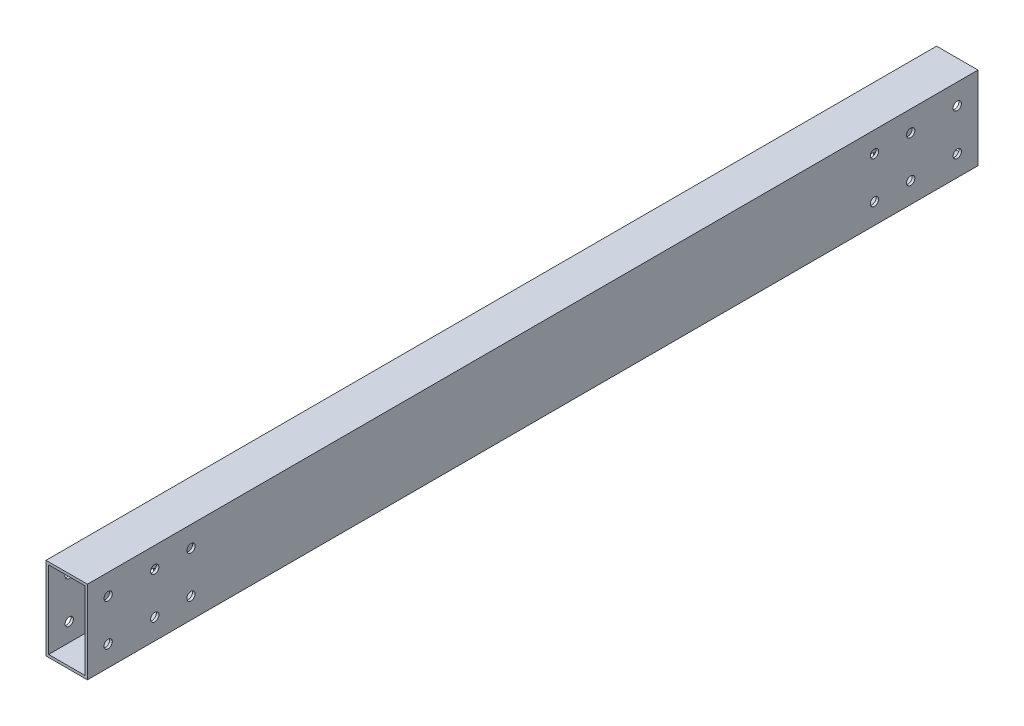
ISO-10303-21;
HEADER;
FILE_DESCRIPTION(('STEP AP214'),'2;1');
FILE_NAME('part.step','',(''),(''),'','','');
FILE_SCHEMA(('AUTOMOTIVE_DESIGN { 1 0 10303 214 1 1 1 1 }'));
ENDSEC;
DATA;
#1=APPLICATION_CONTEXT('core data for automotive mechanical design processes');
#2=APPLICATION_PROTOCOL_DEFINITION('international standard','automotive_design',2000,#1);
#3=PRODUCT_CONTEXT('',#1,'mechanical');
#4=PRODUCT('Part','Part','',(#3));
#5=PRODUCT_RELATED_PRODUCT_CATEGORY('part','',(#4));
#6=PRODUCT_DEFINITION_FORMATION('','',#4);
#7=PRODUCT_DEFINITION_CONTEXT('part definition',#1,'design');
#8=PRODUCT_DEFINITION('design','',#6,#7);
#9=PRODUCT_DEFINITION_SHAPE('','',#8);
#10=(LENGTH_UNIT() NAMED_UNIT(*) SI_UNIT(.MILLI.,.METRE.));
#11=(NAMED_UNIT(*) PLANE_ANGLE_UNIT() SI_UNIT($,.RADIAN.));
#12=(NAMED_UNIT(*) SI_UNIT($,.STERADIAN.) SOLID_ANGLE_UNIT());
#13=UNCERTAINTY_MEASURE_WITH_UNIT(LENGTH_MEASURE(1.E-05),#10,'distance_accuracy_value','');
#14=(GEOMETRIC_REPRESENTATION_CONTEXT(3) GLOBAL_UNCERTAINTY_ASSIGNED_CONTEXT((#13)) GLOBAL_UNIT_ASSIGNED_CONTEXT((#10,
#11,#12)) REPRESENTATION_CONTEXT('',''));
#15=CARTESIAN_POINT('',(0.,0.,0.));
#16=DIRECTION('',(0.,0.,1.));
#17=DIRECTION('',(1.,0.,0.));
#18=AXIS2_PLACEMENT_3D('',#15,#16,#17);
#19=CARTESIAN_POINT('',(0.,0.,546.1));
#20=DIRECTION('',(0.,0.,-1.));
#21=DIRECTION('',(-1.,0.,0.));
#22=AXIS2_PLACEMENT_3D('',#19,#20,#21);
#23=PLANE('',#22);
#24=DIRECTION('',(0.,-1.,0.));
#25=VECTOR('',#24,1.);
#26=CARTESIAN_POINT('',(0.,0.,546.1));
#27=LINE('',#26,#25);
#28=CARTESIAN_POINT('',(0.,50.8,546.1));
#29=VERTEX_POINT('',#28);
#30=CARTESIAN_POINT('',(0.,0.,546.1));
#31=VERTEX_POINT('',#30);
#32=EDGE_CURVE('E141',#29,#31,#27,.T.);
#33=ORIENTED_EDGE('',*,*,#32,.T.);
#34=DIRECTION('',(1.,0.,0.));
#35=VECTOR('',#34,1.);
#36=CARTESIAN_POINT('',(0.,0.,546.1));
#37=LINE('',#36,#35);
#38=CARTESIAN_POINT('',(25.4,0.,546.1));
#39=VERTEX_POINT('',#38);
#40=EDGE_CURVE('E144',#31,#39,#37,.T.);
#41=ORIENTED_EDGE('',*,*,#40,.T.);
#42=DIRECTION('',(0.,1.,0.));
#43=VECTOR('',#42,1.);
#44=CARTESIAN_POINT('',(25.4,0.,546.1));
#45=LINE('',#44,#43);
#46=CARTESIAN_POINT('',(25.4,50.8,546.1));
#47=VERTEX_POINT('',#46);
#48=EDGE_CURVE('E147',#39,#47,#45,.T.);
#49=ORIENTED_EDGE('',*,*,#48,.T.);
#50=DIRECTION('',(-1.,0.,0.));
#51=VECTOR('',#50,1.);
#52=CARTESIAN_POINT('',(0.,50.8,546.1));
#53=LINE('',#52,#51);
#54=EDGE_CURVE('E149',#47,#29,#53,.T.);
#55=ORIENTED_EDGE('',*,*,#54,.T.);
#56=EDGE_LOOP('',(#33,#41,#49,#55));
#57=FACE_BOUND('',#56,.T.);
#58=DIRECTION('',(0.,-1.,0.));
#59=VECTOR('',#58,1.);
#60=CARTESIAN_POINT('',(1.5875,1.5875,546.1));
#61=LINE('',#60,#59);
#62=CARTESIAN_POINT('',(1.5875,49.2125,546.1));
#63=VERTEX_POINT('',#62);
#64=CARTESIAN_POINT('',(1.5875,1.5875,546.1));
#65=VERTEX_POINT('',#64);
#66=EDGE_CURVE('E103',#63,#65,#61,.T.);
#67=ORIENTED_EDGE('',*,*,#66,.F.);
#68=DIRECTION('',(-1.,0.,0.));
#69=VECTOR('',#68,1.);
#70=CARTESIAN_POINT('',(1.5875,49.2125,546.1));
#71=LINE('',#70,#69);
#72=CARTESIAN_POINT('',(23.8125,49.2125,546.1));
#73=VERTEX_POINT('',#72);
#74=EDGE_CURVE('E125',#73,#63,#71,.T.);
#75=ORIENTED_EDGE('',*,*,#74,.F.);
#76=DIRECTION('',(0.,1.,0.));
#77=VECTOR('',#76,1.);
#78=CARTESIAN_POINT('',(23.8125,1.5875,546.1));
#79=LINE('',#78,#77);
#80=CARTESIAN_POINT('',(23.8125,1.5875,546.1));
#81=VERTEX_POINT('',#80);
#82=EDGE_CURVE('E123',#81,#73,#79,.T.);
#83=ORIENTED_EDGE('',*,*,#82,.F.);
#84=DIRECTION('',(1.,0.,0.));
#85=VECTOR('',#84,1.);
#86=CARTESIAN_POINT('',(1.5875,1.5875,546.1));
#87=LINE('',#86,#85);
#88=EDGE_CURVE('E111',#65,#81,#87,.T.);
#89=ORIENTED_EDGE('',*,*,#88,.F.);
#90=EDGE_LOOP('',(#67,#75,#83,#89));
#91=FACE_BOUND('',#90,.T.);
#92=ADVANCED_FACE('F36',(#57,#91),#23,.F.);
#93=CARTESIAN_POINT('',(0.,0.,0.));
#94=DIRECTION('',(0.,0.,-1.));
#95=DIRECTION('',(-1.,0.,0.));
#96=AXIS2_PLACEMENT_3D('',#93,#94,#95);
#97=PLANE('',#96);
#98=DIRECTION('',(0.,-1.,0.));
#99=VECTOR('',#98,1.);
#100=CARTESIAN_POINT('',(0.,0.,0.));
#101=LINE('',#100,#99);
#102=CARTESIAN_POINT('',(0.,50.8,0.));
#103=VERTEX_POINT('',#102);
#104=CARTESIAN_POINT('',(0.,0.,0.));
#105=VERTEX_POINT('',#104);
#106=EDGE_CURVE('E119',#103,#105,#101,.T.);
#107=ORIENTED_EDGE('',*,*,#106,.F.);
#108=DIRECTION('',(-1.,0.,0.));
#109=VECTOR('',#108,1.);
#110=CARTESIAN_POINT('',(0.,50.8,0.));
#111=LINE('',#110,#109);
#112=CARTESIAN_POINT('',(25.4,50.8,0.));
#113=VERTEX_POINT('',#112);
#114=EDGE_CURVE('E145',#113,#103,#111,.T.);
#115=ORIENTED_EDGE('',*,*,#114,.F.);
#116=DIRECTION('',(0.,1.,0.));
#117=VECTOR('',#116,1.);
#118=CARTESIAN_POINT('',(25.4,0.,0.));
#119=LINE('',#118,#117);
#120=CARTESIAN_POINT('',(25.4,0.,0.));
#121=VERTEX_POINT('',#120);
#122=EDGE_CURVE('E156',#121,#113,#119,.T.);
#123=ORIENTED_EDGE('',*,*,#122,.F.);
#124=DIRECTION('',(1.,0.,0.));
#125=VECTOR('',#124,1.);
#126=CARTESIAN_POINT('',(0.,0.,0.));
#127=LINE('',#126,#125);
#128=EDGE_CURVE('E154',#105,#121,#127,.T.);
#129=ORIENTED_EDGE('',*,*,#128,.F.);
#130=EDGE_LOOP('',(#107,#115,#123,#129));
#131=FACE_BOUND('',#130,.T.);
#132=DIRECTION('',(-1.,0.,0.));
#133=VECTOR('',#132,1.);
#134=CARTESIAN_POINT('',(1.5875,49.2125,0.));
#135=LINE('',#134,#133);
#136=CARTESIAN_POINT('',(23.8125,49.2125,0.));
#137=VERTEX_POINT('',#136);
#138=CARTESIAN_POINT('',(1.5875,49.2125,0.));
#139=VERTEX_POINT('',#138);
#140=EDGE_CURVE('E112',#137,#139,#135,.T.);
#141=ORIENTED_EDGE('',*,*,#140,.T.);
#142=DIRECTION('',(0.,-1.,0.));
#143=VECTOR('',#142,1.);
#144=CARTESIAN_POINT('',(1.5875,1.5875,0.));
#145=LINE('',#144,#143);
#146=CARTESIAN_POINT('',(1.5875,1.5875,0.));
#147=VERTEX_POINT('',#146);
#148=EDGE_CURVE('E61',#139,#147,#145,.T.);
#149=ORIENTED_EDGE('',*,*,#148,.T.);
#150=DIRECTION('',(1.,0.,0.));
#151=VECTOR('',#150,1.);
#152=CARTESIAN_POINT('',(1.5875,1.5875,0.));
#153=LINE('',#152,#151);
#154=CARTESIAN_POINT('',(23.8125,1.5875,0.));
#155=VERTEX_POINT('',#154);
#156=EDGE_CURVE('E118',#147,#155,#153,.T.);
#157=ORIENTED_EDGE('',*,*,#156,.T.);
#158=DIRECTION('',(0.,1.,0.));
#159=VECTOR('',#158,1.);
#160=CARTESIAN_POINT('',(23.8125,1.5875,0.));
#161=LINE('',#160,#159);
#162=EDGE_CURVE('E133',#155,#137,#161,.T.);
#163=ORIENTED_EDGE('',*,*,#162,.T.);
#164=EDGE_LOOP('',(#141,#149,#157,#163));
#165=FACE_BOUND('',#164,.T.);
#166=ADVANCED_FACE('F256',(#131,#165),#97,.T.);
#167=CARTESIAN_POINT('',(0.,0.,546.1));
#168=DIRECTION('',(1.,0.,0.));
#169=DIRECTION('',(0.,0.,-1.));
#170=AXIS2_PLACEMENT_3D('',#167,#168,#169);
#171=PLANE('',#170);
#172=CARTESIAN_POINT('',(0.,12.7,63.5));
#173=DIRECTION('',(1.,0.,0.));
#174=DIRECTION('',(0.,0.,1.));
#175=AXIS2_PLACEMENT_3D('',#172,#173,#174);
#176=CIRCLE('',#175,2.53999999999995);
#177=CARTESIAN_POINT('',(0.,12.7,66.0399999999999));
#178=VERTEX_POINT('',#177);
#179=EDGE_CURVE('E309',#178,#178,#176,.T.);
#180=ORIENTED_EDGE('',*,*,#179,.T.);
#181=EDGE_LOOP('',(#180));
#182=FACE_BOUND('',#181,.T.);
#183=CARTESIAN_POINT('',(0.,12.7,12.7));
#184=DIRECTION('',(1.,0.,0.));
#185=DIRECTION('',(0.,0.,1.));
#186=AXIS2_PLACEMENT_3D('',#183,#184,#185);
#187=CIRCLE('',#186,2.53999999999996);
#188=CARTESIAN_POINT('',(0.,12.7,15.24));
#189=VERTEX_POINT('',#188);
#190=EDGE_CURVE('E313',#189,#189,#187,.T.);
#191=ORIENTED_EDGE('',*,*,#190,.T.);
#192=EDGE_LOOP('',(#191));
#193=FACE_BOUND('',#192,.T.);
#194=CARTESIAN_POINT('',(0.,38.1,12.7));
#195=DIRECTION('',(1.,0.,0.));
#196=DIRECTION('',(0.,0.,1.));
#197=AXIS2_PLACEMENT_3D('',#194,#195,#196);
#198=CIRCLE('',#197,2.53999999999995);
#199=CARTESIAN_POINT('',(0.,38.1,15.24));
#200=VERTEX_POINT('',#199);
#201=EDGE_CURVE('E317',#200,#200,#198,.T.);
#202=ORIENTED_EDGE('',*,*,#201,.T.);
#203=EDGE_LOOP('',(#202));
#204=FACE_BOUND('',#203,.T.);
#205=CARTESIAN_POINT('',(0.,38.1,533.4));
#206=DIRECTION('',(1.,0.,0.));
#207=DIRECTION('',(0.,0.,-1.));
#208=AXIS2_PLACEMENT_3D('',#205,#206,#207);
#209=CIRCLE('',#208,2.53999999999995);
#210=CARTESIAN_POINT('',(0.,38.1,530.86));
#211=VERTEX_POINT('',#210);
#212=EDGE_CURVE('E321',#211,#211,#209,.T.);
#213=ORIENTED_EDGE('',*,*,#212,.T.);
#214=EDGE_LOOP('',(#213));
#215=FACE_BOUND('',#214,.T.);
#216=CARTESIAN_POINT('',(0.,12.7,504.825));
#217=DIRECTION('',(1.,0.,0.));
#218=DIRECTION('',(0.,0.,-1.));
#219=AXIS2_PLACEMENT_3D('',#216,#217,#218);
#220=CIRCLE('',#219,2.53999999999996);
#221=CARTESIAN_POINT('',(0.,12.7,502.285));
#222=VERTEX_POINT('',#221);
#223=EDGE_CURVE('E325',#222,#222,#220,.T.);
#224=ORIENTED_EDGE('',*,*,#223,.T.);
#225=EDGE_LOOP('',(#224));
#226=FACE_BOUND('',#225,.T.);
#227=CARTESIAN_POINT('',(0.,38.1,482.6));
#228=DIRECTION('',(1.,0.,0.));
#229=DIRECTION('',(0.,0.,-1.));
#230=AXIS2_PLACEMENT_3D('',#227,#228,#229);
#231=CIRCLE('',#230,2.53999999999995);
#232=CARTESIAN_POINT('',(0.,38.1,480.06));
#233=VERTEX_POINT('',#232);
#234=EDGE_CURVE('E329',#233,#233,#231,.T.);
#235=ORIENTED_EDGE('',*,*,#234,.T.);
#236=EDGE_LOOP('',(#235));
#237=FACE_BOUND('',#236,.T.);
#238=CARTESIAN_POINT('',(0.,12.7,482.6));
#239=DIRECTION('',(1.,0.,0.));
#240=DIRECTION('',(0.,0.,-1.));
#241=AXIS2_PLACEMENT_3D('',#238,#239,#240);
#242=CIRCLE('',#241,2.53999999999995);
#243=CARTESIAN_POINT('',(0.,12.7,480.06));
#244=VERTEX_POINT('',#243);
#245=EDGE_CURVE('E333',#244,#244,#242,.T.);
#246=ORIENTED_EDGE('',*,*,#245,.T.);
#247=EDGE_LOOP('',(#246));
#248=FACE_BOUND('',#247,.T.);
#249=CARTESIAN_POINT('',(0.,12.7,533.4));
#250=DIRECTION('',(1.,0.,0.));
#251=DIRECTION('',(0.,0.,-1.));
#252=AXIS2_PLACEMENT_3D('',#249,#250,#251);
#253=CIRCLE('',#252,2.53999999999996);
#254=CARTESIAN_POINT('',(0.,12.7,530.86));
#255=VERTEX_POINT('',#254);
#256=EDGE_CURVE('E337',#255,#255,#253,.T.);
#257=ORIENTED_EDGE('',*,*,#256,.T.);
#258=EDGE_LOOP('',(#257));
#259=FACE_BOUND('',#258,.T.);
#260=CARTESIAN_POINT('',(0.,38.1,41.2749999999999));
#261=DIRECTION('',(1.,0.,0.));
#262=DIRECTION('',(0.,0.,1.));
#263=AXIS2_PLACEMENT_3D('',#260,#261,#262);
#264=CIRCLE('',#263,2.53999999999995);
#265=CARTESIAN_POINT('',(0.,38.1,43.8149999999999));
#266=VERTEX_POINT('',#265);
#267=EDGE_CURVE('E341',#266,#266,#264,.T.);
#268=ORIENTED_EDGE('',*,*,#267,.T.);
#269=EDGE_LOOP('',(#268));
#270=FACE_BOUND('',#269,.T.);
#271=CARTESIAN_POINT('',(0.,12.7,41.2749999999999));
#272=DIRECTION('',(1.,0.,0.));
#273=DIRECTION('',(0.,0.,1.));
#274=AXIS2_PLACEMENT_3D('',#271,#272,#273);
#275=CIRCLE('',#274,2.53999999999996);
#276=CARTESIAN_POINT('',(0.,12.7,43.8149999999999));
#277=VERTEX_POINT('',#276);
#278=EDGE_CURVE('E345',#277,#277,#275,.T.);
#279=ORIENTED_EDGE('',*,*,#278,.T.);
#280=EDGE_LOOP('',(#279));
#281=FACE_BOUND('',#280,.T.);
#282=CARTESIAN_POINT('',(0.,38.1,63.5));
#283=DIRECTION('',(1.,0.,0.));
#284=DIRECTION('',(0.,0.,1.));
#285=AXIS2_PLACEMENT_3D('',#282,#283,#284);
#286=CIRCLE('',#285,2.53999999999995);
#287=CARTESIAN_POINT('',(0.,38.1,66.0399999999999));
#288=VERTEX_POINT('',#287);
#289=EDGE_CURVE('E349',#288,#288,#286,.T.);
#290=ORIENTED_EDGE('',*,*,#289,.T.);
#291=EDGE_LOOP('',(#290));
#292=FACE_BOUND('',#291,.T.);
#293=CARTESIAN_POINT('',(0.,38.1,504.825));
#294=DIRECTION('',(1.,0.,0.));
#295=DIRECTION('',(0.,0.,-1.));
#296=AXIS2_PLACEMENT_3D('',#293,#294,#295);
#297=CIRCLE('',#296,2.53999999999995);
#298=CARTESIAN_POINT('',(0.,38.1,502.285));
#299=VERTEX_POINT('',#298);
#300=EDGE_CURVE('E170',#299,#299,#297,.T.);
#301=ORIENTED_EDGE('',*,*,#300,.T.);
#302=EDGE_LOOP('',(#301));
#303=FACE_BOUND('',#302,.T.);
#304=ORIENTED_EDGE('',*,*,#106,.T.);
#305=DIRECTION('',(0.,0.,-1.));
#306=VECTOR('',#305,1.);
#307=CARTESIAN_POINT('',(0.,0.,546.1));
#308=LINE('',#307,#306);
#309=EDGE_CURVE('E11',#31,#105,#308,.T.);
#310=ORIENTED_EDGE('',*,*,#309,.F.);
#311=ORIENTED_EDGE('',*,*,#32,.F.);
#312=DIRECTION('',(0.,0.,-1.));
#313=VECTOR('',#312,1.);
#314=CARTESIAN_POINT('',(0.,50.8,546.1));
#315=LINE('',#314,#313);
#316=EDGE_CURVE('E151',#29,#103,#315,.T.);
#317=ORIENTED_EDGE('',*,*,#316,.T.);
#318=EDGE_LOOP('',(#304,#310,#311,#317));
#319=FACE_BOUND('',#318,.T.);
#320=ADVANCED_FACE('F38',(#182,#193,#204,#215,#226,#237,#248,#259,#270,#281,#292,#303,#319),
#171,.F.);
#321=CARTESIAN_POINT('',(0.,0.,546.1));
#322=DIRECTION('',(0.,1.,0.));
#323=DIRECTION('',(0.,0.,1.));
#324=AXIS2_PLACEMENT_3D('',#321,#322,#323);
#325=PLANE('',#324);
#326=ORIENTED_EDGE('',*,*,#128,.T.);
#327=DIRECTION('',(0.,0.,-1.));
#328=VECTOR('',#327,1.);
#329=CARTESIAN_POINT('',(25.4,0.,546.1));
#330=LINE('',#329,#328);
#331=EDGE_CURVE('E45',#39,#121,#330,.T.);
#332=ORIENTED_EDGE('',*,*,#331,.F.);
#333=ORIENTED_EDGE('',*,*,#40,.F.);
#334=ORIENTED_EDGE('',*,*,#309,.T.);
#335=EDGE_LOOP('',(#326,#332,#333,#334));
#336=FACE_BOUND('',#335,.T.);
#337=ADVANCED_FACE('F284',(#336),#325,.F.);
#338=CARTESIAN_POINT('',(25.4,0.,546.1));
#339=DIRECTION('',(-1.,0.,0.));
#340=DIRECTION('',(0.,0.,1.));
#341=AXIS2_PLACEMENT_3D('',#338,#339,#340);
#342=PLANE('',#341);
#343=CARTESIAN_POINT('',(25.4,12.7,63.5));
#344=DIRECTION('',(1.,0.,0.));
#345=DIRECTION('',(0.,0.,1.));
#346=AXIS2_PLACEMENT_3D('',#343,#344,#345);
#347=CIRCLE('',#346,2.53999999999995);
#348=CARTESIAN_POINT('',(25.4,12.7,66.0399999999999));
#349=VERTEX_POINT('',#348);
#350=EDGE_CURVE('E473',#349,#349,#347,.T.);
#351=ORIENTED_EDGE('',*,*,#350,.F.);
#352=EDGE_LOOP('',(#351));
#353=FACE_BOUND('',#352,.T.);
#354=CARTESIAN_POINT('',(25.4,12.7,12.7));
#355=DIRECTION('',(1.,0.,0.));
#356=DIRECTION('',(0.,0.,1.));
#357=AXIS2_PLACEMENT_3D('',#354,#355,#356);
#358=CIRCLE('',#357,2.53999999999996);
#359=CARTESIAN_POINT('',(25.4,12.7,15.24));
#360=VERTEX_POINT('',#359);
#361=EDGE_CURVE('E488',#360,#360,#358,.T.);
#362=ORIENTED_EDGE('',*,*,#361,.F.);
#363=EDGE_LOOP('',(#362));
#364=FACE_BOUND('',#363,.T.);
#365=CARTESIAN_POINT('',(25.4,38.1,12.7));
#366=DIRECTION('',(1.,0.,0.));
#367=DIRECTION('',(0.,0.,1.));
#368=AXIS2_PLACEMENT_3D('',#365,#366,#367);
#369=CIRCLE('',#368,2.53999999999995);
#370=CARTESIAN_POINT('',(25.4,38.1,15.24));
#371=VERTEX_POINT('',#370);
#372=EDGE_CURVE('E484',#371,#371,#369,.T.);
#373=ORIENTED_EDGE('',*,*,#372,.F.);
#374=EDGE_LOOP('',(#373));
#375=FACE_BOUND('',#374,.T.);
#376=CARTESIAN_POINT('',(25.4,38.1,533.4));
#377=DIRECTION('',(1.,0.,0.));
#378=DIRECTION('',(0.,0.,-1.));
#379=AXIS2_PLACEMENT_3D('',#376,#377,#378);
#380=CIRCLE('',#379,2.53999999999995);
#381=CARTESIAN_POINT('',(25.4,38.1,530.86));
#382=VERTEX_POINT('',#381);
#383=EDGE_CURVE('E480',#382,#382,#380,.T.);
#384=ORIENTED_EDGE('',*,*,#383,.F.);
#385=EDGE_LOOP('',(#384));
#386=FACE_BOUND('',#385,.T.);
#387=CARTESIAN_POINT('',(25.4,12.7,504.825));
#388=DIRECTION('',(1.,0.,0.));
#389=DIRECTION('',(0.,0.,-1.));
#390=AXIS2_PLACEMENT_3D('',#387,#388,#389);
#391=CIRCLE('',#390,2.53999999999996);
#392=CARTESIAN_POINT('',(25.4,12.7,502.285));
#393=VERTEX_POINT('',#392);
#394=EDGE_CURVE('E502',#393,#393,#391,.T.);
#395=ORIENTED_EDGE('',*,*,#394,.F.);
#396=EDGE_LOOP('',(#395));
#397=FACE_BOUND('',#396,.T.);
#398=CARTESIAN_POINT('',(25.4,38.1,482.6));
#399=DIRECTION('',(1.,0.,0.));
#400=DIRECTION('',(0.,0.,-1.));
#401=AXIS2_PLACEMENT_3D('',#398,#399,#400);
#402=CIRCLE('',#401,2.53999999999995);
#403=CARTESIAN_POINT('',(25.4,38.1,480.06));
#404=VERTEX_POINT('',#403);
#405=EDGE_CURVE('E358',#404,#404,#402,.T.);
#406=ORIENTED_EDGE('',*,*,#405,.F.);
#407=EDGE_LOOP('',(#406));
#408=FACE_BOUND('',#407,.T.);
#409=CARTESIAN_POINT('',(25.4,12.7,482.6));
#410=DIRECTION('',(1.,0.,0.));
#411=DIRECTION('',(0.,0.,-1.));
#412=AXIS2_PLACEMENT_3D('',#409,#410,#411);
#413=CIRCLE('',#412,2.53999999999995);
#414=CARTESIAN_POINT('',(25.4,12.7,480.06));
#415=VERTEX_POINT('',#414);
#416=EDGE_CURVE('E495',#415,#415,#413,.T.);
#417=ORIENTED_EDGE('',*,*,#416,.F.);
#418=EDGE_LOOP('',(#417));
#419=FACE_BOUND('',#418,.T.);
#420=CARTESIAN_POINT('',(25.4,12.7,533.4));
#421=DIRECTION('',(1.,0.,0.));
#422=DIRECTION('',(0.,0.,-1.));
#423=AXIS2_PLACEMENT_3D('',#420,#421,#422);
#424=CIRCLE('',#423,2.53999999999996);
#425=CARTESIAN_POINT('',(25.4,12.7,530.86));
#426=VERTEX_POINT('',#425);
#427=EDGE_CURVE('E479',#426,#426,#424,.T.);
#428=ORIENTED_EDGE('',*,*,#427,.F.);
#429=EDGE_LOOP('',(#428));
#430=FACE_BOUND('',#429,.T.);
#431=CARTESIAN_POINT('',(25.4,38.1,41.2749999999999));
#432=DIRECTION('',(1.,0.,0.));
#433=DIRECTION('',(0.,0.,1.));
#434=AXIS2_PLACEMENT_3D('',#431,#432,#433);
#435=CIRCLE('',#434,2.53999999999995);
#436=CARTESIAN_POINT('',(25.4,38.1,43.8149999999999));
#437=VERTEX_POINT('',#436);
#438=EDGE_CURVE('E465',#437,#437,#435,.T.);
#439=ORIENTED_EDGE('',*,*,#438,.F.);
#440=EDGE_LOOP('',(#439));
#441=FACE_BOUND('',#440,.T.);
#442=CARTESIAN_POINT('',(25.4,12.7,41.2749999999999));
#443=DIRECTION('',(1.,0.,0.));
#444=DIRECTION('',(0.,0.,1.));
#445=AXIS2_PLACEMENT_3D('',#442,#443,#444);
#446=CIRCLE('',#445,2.53999999999996);
#447=CARTESIAN_POINT('',(25.4,12.7,43.8149999999999));
#448=VERTEX_POINT('',#447);
#449=EDGE_CURVE('E464',#448,#448,#446,.T.);
#450=ORIENTED_EDGE('',*,*,#449,.F.);
#451=EDGE_LOOP('',(#450));
#452=FACE_BOUND('',#451,.T.);
#453=CARTESIAN_POINT('',(25.4,38.1,63.5));
#454=DIRECTION('',(1.,0.,0.));
#455=DIRECTION('',(0.,0.,1.));
#456=AXIS2_PLACEMENT_3D('',#453,#454,#455);
#457=CIRCLE('',#456,2.53999999999995);
#458=CARTESIAN_POINT('',(25.4,38.1,66.0399999999999));
#459=VERTEX_POINT('',#458);
#460=EDGE_CURVE('E474',#459,#459,#457,.T.);
#461=ORIENTED_EDGE('',*,*,#460,.F.);
#462=EDGE_LOOP('',(#461));
#463=FACE_BOUND('',#462,.T.);
#464=CARTESIAN_POINT('',(25.4,38.1,504.825));
#465=DIRECTION('',(1.,0.,0.));
#466=DIRECTION('',(0.,0.,-1.));
#467=AXIS2_PLACEMENT_3D('',#464,#465,#466);
#468=CIRCLE('',#467,2.53999999999995);
#469=CARTESIAN_POINT('',(25.4,38.1,502.285));
#470=VERTEX_POINT('',#469);
#471=EDGE_CURVE('E353',#470,#470,#468,.T.);
#472=ORIENTED_EDGE('',*,*,#471,.F.);
#473=EDGE_LOOP('',(#472));
#474=FACE_BOUND('',#473,.T.);
#475=ORIENTED_EDGE('',*,*,#122,.T.);
#476=DIRECTION('',(0.,0.,-1.));
#477=VECTOR('',#476,1.);
#478=CARTESIAN_POINT('',(25.4,50.8,546.1));
#479=LINE('',#478,#477);
#480=EDGE_CURVE('E161',#47,#113,#479,.T.);
#481=ORIENTED_EDGE('',*,*,#480,.F.);
#482=ORIENTED_EDGE('',*,*,#48,.F.);
#483=ORIENTED_EDGE('',*,*,#331,.T.);
#484=EDGE_LOOP('',(#475,#481,#482,#483));
#485=FACE_BOUND('',#484,.T.);
#486=ADVANCED_FACE('F281',(#353,#364,#375,#386,#397,#408,#419,#430,#441,#452,#463,#474,#485),
#342,.F.);
#487=CARTESIAN_POINT('',(0.,50.8,546.1));
#488=DIRECTION('',(0.,-1.,0.));
#489=DIRECTION('',(0.,0.,-1.));
#490=AXIS2_PLACEMENT_3D('',#487,#488,#489);
#491=PLANE('',#490);
#492=ORIENTED_EDGE('',*,*,#114,.T.);
#493=ORIENTED_EDGE('',*,*,#316,.F.);
#494=ORIENTED_EDGE('',*,*,#54,.F.);
#495=ORIENTED_EDGE('',*,*,#480,.T.);
#496=EDGE_LOOP('',(#492,#493,#494,#495));
#497=FACE_BOUND('',#496,.T.);
#498=ADVANCED_FACE('F278',(#497),#491,.F.);
#499=CARTESIAN_POINT('',(1.5875,1.5875,546.1));
#500=DIRECTION('',(1.,0.,0.));
#501=DIRECTION('',(0.,0.,-1.));
#502=AXIS2_PLACEMENT_3D('',#499,#500,#501);
#503=PLANE('',#502);
#504=CARTESIAN_POINT('',(1.5875,12.7,63.5));
#505=DIRECTION('',(1.,0.,0.));
#506=DIRECTION('',(0.,0.,-1.));
#507=AXIS2_PLACEMENT_3D('',#504,#505,#506);
#508=CIRCLE('',#507,2.53999999999995);
#509=CARTESIAN_POINT('',(1.5875,12.7,60.9600000000001));
#510=VERTEX_POINT('',#509);
#511=EDGE_CURVE('E131',#510,#510,#508,.T.);
#512=ORIENTED_EDGE('',*,*,#511,.F.);
#513=EDGE_LOOP('',(#512));
#514=FACE_BOUND('',#513,.T.);
#515=CARTESIAN_POINT('',(1.5875,12.7,12.7));
#516=DIRECTION('',(1.,0.,0.));
#517=DIRECTION('',(0.,0.,-1.));
#518=AXIS2_PLACEMENT_3D('',#515,#516,#517);
#519=CIRCLE('',#518,2.53999999999996);
#520=CARTESIAN_POINT('',(1.5875,12.7,10.1600000000001));
#521=VERTEX_POINT('',#520);
#522=EDGE_CURVE('E208',#521,#521,#519,.T.);
#523=ORIENTED_EDGE('',*,*,#522,.F.);
#524=EDGE_LOOP('',(#523));
#525=FACE_BOUND('',#524,.T.);
#526=CARTESIAN_POINT('',(1.5875,38.1,12.7));
#527=DIRECTION('',(1.,0.,0.));
#528=DIRECTION('',(0.,0.,-1.));
#529=AXIS2_PLACEMENT_3D('',#526,#527,#528);
#530=CIRCLE('',#529,2.53999999999995);
#531=CARTESIAN_POINT('',(1.5875,38.1,10.1600000000001));
#532=VERTEX_POINT('',#531);
#533=EDGE_CURVE('E205',#532,#532,#530,.T.);
#534=ORIENTED_EDGE('',*,*,#533,.F.);
#535=EDGE_LOOP('',(#534));
#536=FACE_BOUND('',#535,.T.);
#537=CARTESIAN_POINT('',(1.5875,38.1,533.4));
#538=DIRECTION('',(1.,0.,0.));
#539=DIRECTION('',(0.,0.,-1.));
#540=AXIS2_PLACEMENT_3D('',#537,#538,#539);
#541=CIRCLE('',#540,2.53999999999995);
#542=CARTESIAN_POINT('',(1.5875,38.1,530.86));
#543=VERTEX_POINT('',#542);
#544=EDGE_CURVE('E202',#543,#543,#541,.T.);
#545=ORIENTED_EDGE('',*,*,#544,.F.);
#546=EDGE_LOOP('',(#545));
#547=FACE_BOUND('',#546,.T.);
#548=CARTESIAN_POINT('',(1.5875,12.7,504.825));
#549=DIRECTION('',(1.,0.,0.));
#550=DIRECTION('',(0.,0.,-1.));
#551=AXIS2_PLACEMENT_3D('',#548,#549,#550);
#552=CIRCLE('',#551,2.53999999999996);
#553=CARTESIAN_POINT('',(1.5875,12.7,502.285));
#554=VERTEX_POINT('',#553);
#555=EDGE_CURVE('E198',#554,#554,#552,.T.);
#556=ORIENTED_EDGE('',*,*,#555,.F.);
#557=EDGE_LOOP('',(#556));
#558=FACE_BOUND('',#557,.T.);
#559=CARTESIAN_POINT('',(1.5875,38.1,482.6));
#560=DIRECTION('',(1.,0.,0.));
#561=DIRECTION('',(0.,0.,-1.));
#562=AXIS2_PLACEMENT_3D('',#559,#560,#561);
#563=CIRCLE('',#562,2.53999999999995);
#564=CARTESIAN_POINT('',(1.5875,38.1,480.06));
#565=VERTEX_POINT('',#564);
#566=EDGE_CURVE('E194',#565,#565,#563,.T.);
#567=ORIENTED_EDGE('',*,*,#566,.F.);
#568=EDGE_LOOP('',(#567));
#569=FACE_BOUND('',#568,.T.);
#570=CARTESIAN_POINT('',(1.5875,12.7,482.6));
#571=DIRECTION('',(1.,0.,0.));
#572=DIRECTION('',(0.,0.,-1.));
#573=AXIS2_PLACEMENT_3D('',#570,#571,#572);
#574=CIRCLE('',#573,2.53999999999995);
#575=CARTESIAN_POINT('',(1.5875,12.7,480.06));
#576=VERTEX_POINT('',#575);
#577=EDGE_CURVE('E190',#576,#576,#574,.T.);
#578=ORIENTED_EDGE('',*,*,#577,.F.);
#579=EDGE_LOOP('',(#578));
#580=FACE_BOUND('',#579,.T.);
#581=CARTESIAN_POINT('',(1.5875,12.7,533.4));
#582=DIRECTION('',(1.,0.,0.));
#583=DIRECTION('',(0.,0.,-1.));
#584=AXIS2_PLACEMENT_3D('',#581,#582,#583);
#585=CIRCLE('',#584,2.53999999999996);
#586=CARTESIAN_POINT('',(1.5875,12.7,530.86));
#587=VERTEX_POINT('',#586);
#588=EDGE_CURVE('E186',#587,#587,#585,.T.);
#589=ORIENTED_EDGE('',*,*,#588,.F.);
#590=EDGE_LOOP('',(#589));
#591=FACE_BOUND('',#590,.T.);
#592=CARTESIAN_POINT('',(1.5875,38.1,41.2749999999999));
#593=DIRECTION('',(1.,0.,0.));
#594=DIRECTION('',(0.,0.,-1.));
#595=AXIS2_PLACEMENT_3D('',#592,#593,#594);
#596=CIRCLE('',#595,2.53999999999995);
#597=CARTESIAN_POINT('',(1.5875,38.1,38.735));
#598=VERTEX_POINT('',#597);
#599=EDGE_CURVE('E182',#598,#598,#596,.T.);
#600=ORIENTED_EDGE('',*,*,#599,.F.);
#601=EDGE_LOOP('',(#600));
#602=FACE_BOUND('',#601,.T.);
#603=CARTESIAN_POINT('',(1.5875,12.7,41.2749999999999));
#604=DIRECTION('',(1.,0.,0.));
#605=DIRECTION('',(0.,0.,-1.));
#606=AXIS2_PLACEMENT_3D('',#603,#604,#605);
#607=CIRCLE('',#606,2.53999999999996);
#608=CARTESIAN_POINT('',(1.5875,12.7,38.735));
#609=VERTEX_POINT('',#608);
#610=EDGE_CURVE('E178',#609,#609,#607,.T.);
#611=ORIENTED_EDGE('',*,*,#610,.F.);
#612=EDGE_LOOP('',(#611));
#613=FACE_BOUND('',#612,.T.);
#614=CARTESIAN_POINT('',(1.5875,38.1,63.5));
#615=DIRECTION('',(1.,0.,0.));
#616=DIRECTION('',(0.,0.,-1.));
#617=AXIS2_PLACEMENT_3D('',#614,#615,#616);
#618=CIRCLE('',#617,2.53999999999995);
#619=CARTESIAN_POINT('',(1.5875,38.1,60.9600000000001));
#620=VERTEX_POINT('',#619);
#621=EDGE_CURVE('E174',#620,#620,#618,.T.);
#622=ORIENTED_EDGE('',*,*,#621,.F.);
#623=EDGE_LOOP('',(#622));
#624=FACE_BOUND('',#623,.T.);
#625=CARTESIAN_POINT('',(1.5875,38.1,504.825));
#626=DIRECTION('',(1.,0.,0.));
#627=DIRECTION('',(0.,0.,-1.));
#628=AXIS2_PLACEMENT_3D('',#625,#626,#627);
#629=CIRCLE('',#628,2.53999999999995);
#630=CARTESIAN_POINT('',(1.5875,38.1,502.285));
#631=VERTEX_POINT('',#630);
#632=EDGE_CURVE('E169',#631,#631,#629,.T.);
#633=ORIENTED_EDGE('',*,*,#632,.F.);
#634=EDGE_LOOP('',(#633));
#635=FACE_BOUND('',#634,.T.);
#636=ORIENTED_EDGE('',*,*,#148,.F.);
#637=DIRECTION('',(0.,0.,-1.));
#638=VECTOR('',#637,1.);
#639=CARTESIAN_POINT('',(1.5875,49.2125,546.1));
#640=LINE('',#639,#638);
#641=EDGE_CURVE('E107',#63,#139,#640,.T.);
#642=ORIENTED_EDGE('',*,*,#641,.F.);
#643=ORIENTED_EDGE('',*,*,#66,.T.);
#644=DIRECTION('',(0.,0.,-1.));
#645=VECTOR('',#644,1.);
#646=CARTESIAN_POINT('',(1.5875,1.5875,546.1));
#647=LINE('',#646,#645);
#648=EDGE_CURVE('E106',#65,#147,#647,.T.);
#649=ORIENTED_EDGE('',*,*,#648,.T.);
#650=EDGE_LOOP('',(#636,#642,#643,#649));
#651=FACE_BOUND('',#650,.T.);
#652=ADVANCED_FACE('F105',(#514,#525,#536,#547,#558,#569,#580,#591,#602,#613,#624,#635,#651),
#503,.T.);
#653=CARTESIAN_POINT('',(1.5875,1.5875,546.1));
#654=DIRECTION('',(0.,1.,0.));
#655=DIRECTION('',(0.,0.,1.));
#656=AXIS2_PLACEMENT_3D('',#653,#654,#655);
#657=PLANE('',#656);
#658=ORIENTED_EDGE('',*,*,#156,.F.);
#659=ORIENTED_EDGE('',*,*,#648,.F.);
#660=ORIENTED_EDGE('',*,*,#88,.T.);
#661=DIRECTION('',(0.,0.,-1.));
#662=VECTOR('',#661,1.);
#663=CARTESIAN_POINT('',(23.8125,1.5875,546.1));
#664=LINE('',#663,#662);
#665=EDGE_CURVE('E120',#81,#155,#664,.T.);
#666=ORIENTED_EDGE('',*,*,#665,.T.);
#667=EDGE_LOOP('',(#658,#659,#660,#666));
#668=FACE_BOUND('',#667,.T.);
#669=ADVANCED_FACE('F115',(#668),#657,.T.);
#670=CARTESIAN_POINT('',(23.8125,1.5875,546.1));
#671=DIRECTION('',(-1.,0.,0.));
#672=DIRECTION('',(0.,0.,1.));
#673=AXIS2_PLACEMENT_3D('',#670,#671,#672);
#674=PLANE('',#673);
#675=CARTESIAN_POINT('',(23.8125,12.7,63.5));
#676=DIRECTION('',(-1.,0.,0.));
#677=DIRECTION('',(0.,0.,1.));
#678=AXIS2_PLACEMENT_3D('',#675,#676,#677);
#679=CIRCLE('',#678,2.53999999999995);
#680=CARTESIAN_POINT('',(23.8125,12.7,66.0399999999999));
#681=VERTEX_POINT('',#680);
#682=EDGE_CURVE('E40',#681,#681,#679,.T.);
#683=ORIENTED_EDGE('',*,*,#682,.F.);
#684=EDGE_LOOP('',(#683));
#685=FACE_BOUND('',#684,.T.);
#686=CARTESIAN_POINT('',(23.8125,12.7,12.7));
#687=DIRECTION('',(-1.,0.,0.));
#688=DIRECTION('',(0.,0.,1.));
#689=AXIS2_PLACEMENT_3D('',#686,#687,#688);
#690=CIRCLE('',#689,2.53999999999996);
#691=CARTESIAN_POINT('',(23.8125,12.7,15.24));
#692=VERTEX_POINT('',#691);
#693=EDGE_CURVE('E206',#692,#692,#690,.T.);
#694=ORIENTED_EDGE('',*,*,#693,.F.);
#695=EDGE_LOOP('',(#694));
#696=FACE_BOUND('',#695,.T.);
#697=CARTESIAN_POINT('',(23.8125,38.1,12.7));
#698=DIRECTION('',(-1.,0.,0.));
#699=DIRECTION('',(0.,0.,1.));
#700=AXIS2_PLACEMENT_3D('',#697,#698,#699);
#701=CIRCLE('',#700,2.53999999999995);
#702=CARTESIAN_POINT('',(23.8125,38.1,15.24));
#703=VERTEX_POINT('',#702);
#704=EDGE_CURVE('E203',#703,#703,#701,.T.);
#705=ORIENTED_EDGE('',*,*,#704,.F.);
#706=EDGE_LOOP('',(#705));
#707=FACE_BOUND('',#706,.T.);
#708=CARTESIAN_POINT('',(23.8125,38.1,533.4));
#709=DIRECTION('',(-1.,0.,0.));
#710=DIRECTION('',(0.,0.,1.));
#711=AXIS2_PLACEMENT_3D('',#708,#709,#710);
#712=CIRCLE('',#711,2.53999999999995);
#713=CARTESIAN_POINT('',(23.8125,38.1,535.94));
#714=VERTEX_POINT('',#713);
#715=EDGE_CURVE('E199',#714,#714,#712,.T.);
#716=ORIENTED_EDGE('',*,*,#715,.F.);
#717=EDGE_LOOP('',(#716));
#718=FACE_BOUND('',#717,.T.);
#719=CARTESIAN_POINT('',(23.8125,12.7,504.825));
#720=DIRECTION('',(-1.,0.,0.));
#721=DIRECTION('',(0.,0.,1.));
#722=AXIS2_PLACEMENT_3D('',#719,#720,#721);
#723=CIRCLE('',#722,2.53999999999996);
#724=CARTESIAN_POINT('',(23.8125,12.7,507.365));
#725=VERTEX_POINT('',#724);
#726=EDGE_CURVE('E195',#725,#725,#723,.T.);
#727=ORIENTED_EDGE('',*,*,#726,.F.);
#728=EDGE_LOOP('',(#727));
#729=FACE_BOUND('',#728,.T.);
#730=CARTESIAN_POINT('',(23.8125,38.1,482.6));
#731=DIRECTION('',(-1.,0.,0.));
#732=DIRECTION('',(0.,0.,1.));
#733=AXIS2_PLACEMENT_3D('',#730,#731,#732);
#734=CIRCLE('',#733,2.53999999999995);
#735=CARTESIAN_POINT('',(23.8125,38.1,485.14));
#736=VERTEX_POINT('',#735);
#737=EDGE_CURVE('E191',#736,#736,#734,.T.);
#738=ORIENTED_EDGE('',*,*,#737,.F.);
#739=EDGE_LOOP('',(#738));
#740=FACE_BOUND('',#739,.T.);
#741=CARTESIAN_POINT('',(23.8125,12.7,482.6));
#742=DIRECTION('',(-1.,0.,0.));
#743=DIRECTION('',(0.,0.,1.));
#744=AXIS2_PLACEMENT_3D('',#741,#742,#743);
#745=CIRCLE('',#744,2.53999999999995);
#746=CARTESIAN_POINT('',(23.8125,12.7,485.14));
#747=VERTEX_POINT('',#746);
#748=EDGE_CURVE('E187',#747,#747,#745,.T.);
#749=ORIENTED_EDGE('',*,*,#748,.F.);
#750=EDGE_LOOP('',(#749));
#751=FACE_BOUND('',#750,.T.);
#752=CARTESIAN_POINT('',(23.8125,12.7,533.4));
#753=DIRECTION('',(-1.,0.,0.));
#754=DIRECTION('',(0.,0.,1.));
#755=AXIS2_PLACEMENT_3D('',#752,#753,#754);
#756=CIRCLE('',#755,2.53999999999996);
#757=CARTESIAN_POINT('',(23.8125,12.7,535.94));
#758=VERTEX_POINT('',#757);
#759=EDGE_CURVE('E183',#758,#758,#756,.T.);
#760=ORIENTED_EDGE('',*,*,#759,.F.);
#761=EDGE_LOOP('',(#760));
#762=FACE_BOUND('',#761,.T.);
#763=CARTESIAN_POINT('',(23.8125,38.1,41.2749999999999));
#764=DIRECTION('',(-1.,0.,0.));
#765=DIRECTION('',(0.,0.,1.));
#766=AXIS2_PLACEMENT_3D('',#763,#764,#765);
#767=CIRCLE('',#766,2.53999999999995);
#768=CARTESIAN_POINT('',(23.8125,38.1,43.8149999999999));
#769=VERTEX_POINT('',#768);
#770=EDGE_CURVE('E179',#769,#769,#767,.T.);
#771=ORIENTED_EDGE('',*,*,#770,.F.);
#772=EDGE_LOOP('',(#771));
#773=FACE_BOUND('',#772,.T.);
#774=CARTESIAN_POINT('',(23.8125,12.7,41.2749999999999));
#775=DIRECTION('',(-1.,0.,0.));
#776=DIRECTION('',(0.,0.,1.));
#777=AXIS2_PLACEMENT_3D('',#774,#775,#776);
#778=CIRCLE('',#777,2.53999999999996);
#779=CARTESIAN_POINT('',(23.8125,12.7,43.8149999999999));
#780=VERTEX_POINT('',#779);
#781=EDGE_CURVE('E175',#780,#780,#778,.T.);
#782=ORIENTED_EDGE('',*,*,#781,.F.);
#783=EDGE_LOOP('',(#782));
#784=FACE_BOUND('',#783,.T.);
#785=CARTESIAN_POINT('',(23.8125,38.1,63.5));
#786=DIRECTION('',(-1.,0.,0.));
#787=DIRECTION('',(0.,0.,1.));
#788=AXIS2_PLACEMENT_3D('',#785,#786,#787);
#789=CIRCLE('',#788,2.53999999999995);
#790=CARTESIAN_POINT('',(23.8125,38.1,66.0399999999999));
#791=VERTEX_POINT('',#790);
#792=EDGE_CURVE('E171',#791,#791,#789,.T.);
#793=ORIENTED_EDGE('',*,*,#792,.F.);
#794=EDGE_LOOP('',(#793));
#795=FACE_BOUND('',#794,.T.);
#796=CARTESIAN_POINT('',(23.8125,38.1,504.825));
#797=DIRECTION('',(-1.,0.,0.));
#798=DIRECTION('',(0.,0.,1.));
#799=AXIS2_PLACEMENT_3D('',#796,#797,#798);
#800=CIRCLE('',#799,2.53999999999995);
#801=CARTESIAN_POINT('',(23.8125,38.1,507.365));
#802=VERTEX_POINT('',#801);
#803=EDGE_CURVE('E166',#802,#802,#800,.T.);
#804=ORIENTED_EDGE('',*,*,#803,.F.);
#805=EDGE_LOOP('',(#804));
#806=FACE_BOUND('',#805,.T.);
#807=ORIENTED_EDGE('',*,*,#162,.F.);
#808=ORIENTED_EDGE('',*,*,#665,.F.);
#809=ORIENTED_EDGE('',*,*,#82,.T.);
#810=DIRECTION('',(0.,0.,-1.));
#811=VECTOR('',#810,1.);
#812=CARTESIAN_POINT('',(23.8125,49.2125,546.1));
#813=LINE('',#812,#811);
#814=EDGE_CURVE('E53',#73,#137,#813,.T.);
#815=ORIENTED_EDGE('',*,*,#814,.T.);
#816=EDGE_LOOP('',(#807,#808,#809,#815));
#817=FACE_BOUND('',#816,.T.);
#818=ADVANCED_FACE('F228',(#685,#696,#707,#718,#729,#740,#751,#762,#773,#784,#795,#806,#817),
#674,.T.);
#819=CARTESIAN_POINT('',(1.5875,49.2125,546.1));
#820=DIRECTION('',(0.,-1.,0.));
#821=DIRECTION('',(0.,0.,-1.));
#822=AXIS2_PLACEMENT_3D('',#819,#820,#821);
#823=PLANE('',#822);
#824=ORIENTED_EDGE('',*,*,#140,.F.);
#825=ORIENTED_EDGE('',*,*,#814,.F.);
#826=ORIENTED_EDGE('',*,*,#74,.T.);
#827=ORIENTED_EDGE('',*,*,#641,.T.);
#828=EDGE_LOOP('',(#824,#825,#826,#827));
#829=FACE_BOUND('',#828,.T.);
#830=ADVANCED_FACE('F231',(#829),#823,.T.);
#831=CARTESIAN_POINT('',(0.,38.1,504.825));
#832=DIRECTION('',(1.,0.,0.));
#833=DIRECTION('',(0.,0.,-1.));
#834=AXIS2_PLACEMENT_3D('',#831,#832,#833);
#835=CYLINDRICAL_SURFACE('',#834,2.53999999999995);
#836=ORIENTED_EDGE('',*,*,#803,.T.);
#837=EDGE_LOOP('',(#836));
#838=FACE_BOUND('',#837,.T.);
#839=ORIENTED_EDGE('',*,*,#471,.T.);
#840=EDGE_LOOP('',(#839));
#841=FACE_BOUND('',#840,.T.);
#842=ADVANCED_FACE('F258',(#838,#841),#835,.F.);
#843=CARTESIAN_POINT('',(0.,38.1,63.5));
#844=DIRECTION('',(1.,0.,0.));
#845=DIRECTION('',(0.,0.,-1.));
#846=AXIS2_PLACEMENT_3D('',#843,#844,#845);
#847=CYLINDRICAL_SURFACE('',#846,2.53999999999995);
#848=ORIENTED_EDGE('',*,*,#792,.T.);
#849=EDGE_LOOP('',(#848));
#850=FACE_BOUND('',#849,.T.);
#851=ORIENTED_EDGE('',*,*,#460,.T.);
#852=EDGE_LOOP('',(#851));
#853=FACE_BOUND('',#852,.T.);
#854=ADVANCED_FACE('F263',(#850,#853),#847,.F.);
#855=CARTESIAN_POINT('',(0.,12.7,41.2749999999999));
#856=DIRECTION('',(1.,0.,0.));
#857=DIRECTION('',(0.,0.,-1.));
#858=AXIS2_PLACEMENT_3D('',#855,#856,#857);
#859=CYLINDRICAL_SURFACE('',#858,2.53999999999996);
#860=ORIENTED_EDGE('',*,*,#781,.T.);
#861=EDGE_LOOP('',(#860));
#862=FACE_BOUND('',#861,.T.);
#863=ORIENTED_EDGE('',*,*,#449,.T.);
#864=EDGE_LOOP('',(#863));
#865=FACE_BOUND('',#864,.T.);
#866=ADVANCED_FACE('F443',(#862,#865),#859,.F.);
#867=CARTESIAN_POINT('',(0.,38.1,41.2749999999999));
#868=DIRECTION('',(1.,0.,0.));
#869=DIRECTION('',(0.,0.,-1.));
#870=AXIS2_PLACEMENT_3D('',#867,#868,#869);
#871=CYLINDRICAL_SURFACE('',#870,2.53999999999995);
#872=ORIENTED_EDGE('',*,*,#770,.T.);
#873=EDGE_LOOP('',(#872));
#874=FACE_BOUND('',#873,.T.);
#875=ORIENTED_EDGE('',*,*,#438,.T.);
#876=EDGE_LOOP('',(#875));
#877=FACE_BOUND('',#876,.T.);
#878=ADVANCED_FACE('F424',(#874,#877),#871,.F.);
#879=CARTESIAN_POINT('',(0.,12.7,533.4));
#880=DIRECTION('',(1.,0.,0.));
#881=DIRECTION('',(0.,0.,-1.));
#882=AXIS2_PLACEMENT_3D('',#879,#880,#881);
#883=CYLINDRICAL_SURFACE('',#882,2.53999999999996);
#884=ORIENTED_EDGE('',*,*,#759,.T.);
#885=EDGE_LOOP('',(#884));
#886=FACE_BOUND('',#885,.T.);
#887=ORIENTED_EDGE('',*,*,#427,.T.);
#888=EDGE_LOOP('',(#887));
#889=FACE_BOUND('',#888,.T.);
#890=ADVANCED_FACE('F421',(#886,#889),#883,.F.);
#891=CARTESIAN_POINT('',(0.,12.7,482.6));
#892=DIRECTION('',(1.,0.,0.));
#893=DIRECTION('',(0.,0.,-1.));
#894=AXIS2_PLACEMENT_3D('',#891,#892,#893);
#895=CYLINDRICAL_SURFACE('',#894,2.53999999999995);
#896=ORIENTED_EDGE('',*,*,#748,.T.);
#897=EDGE_LOOP('',(#896));
#898=FACE_BOUND('',#897,.T.);
#899=ORIENTED_EDGE('',*,*,#416,.T.);
#900=EDGE_LOOP('',(#899));
#901=FACE_BOUND('',#900,.T.);
#902=ADVANCED_FACE('F414',(#898,#901),#895,.F.);
#903=CARTESIAN_POINT('',(0.,38.1,482.6));
#904=DIRECTION('',(1.,0.,0.));
#905=DIRECTION('',(0.,0.,-1.));
#906=AXIS2_PLACEMENT_3D('',#903,#904,#905);
#907=CYLINDRICAL_SURFACE('',#906,2.53999999999995);
#908=ORIENTED_EDGE('',*,*,#737,.T.);
#909=EDGE_LOOP('',(#908));
#910=FACE_BOUND('',#909,.T.);
#911=ORIENTED_EDGE('',*,*,#405,.T.);
#912=EDGE_LOOP('',(#911));
#913=FACE_BOUND('',#912,.T.);
#914=ADVANCED_FACE('F410',(#910,#913),#907,.F.);
#915=CARTESIAN_POINT('',(0.,12.7,504.825));
#916=DIRECTION('',(1.,0.,0.));
#917=DIRECTION('',(0.,0.,-1.));
#918=AXIS2_PLACEMENT_3D('',#915,#916,#917);
#919=CYLINDRICAL_SURFACE('',#918,2.53999999999996);
#920=ORIENTED_EDGE('',*,*,#726,.T.);
#921=EDGE_LOOP('',(#920));
#922=FACE_BOUND('',#921,.T.);
#923=ORIENTED_EDGE('',*,*,#394,.T.);
#924=EDGE_LOOP('',(#923));
#925=FACE_BOUND('',#924,.T.);
#926=ADVANCED_FACE('F413',(#922,#925),#919,.F.);
#927=CARTESIAN_POINT('',(0.,38.1,533.4));
#928=DIRECTION('',(1.,0.,0.));
#929=DIRECTION('',(0.,0.,-1.));
#930=AXIS2_PLACEMENT_3D('',#927,#928,#929);
#931=CYLINDRICAL_SURFACE('',#930,2.53999999999995);
#932=ORIENTED_EDGE('',*,*,#715,.T.);
#933=EDGE_LOOP('',(#932));
#934=FACE_BOUND('',#933,.T.);
#935=ORIENTED_EDGE('',*,*,#383,.T.);
#936=EDGE_LOOP('',(#935));
#937=FACE_BOUND('',#936,.T.);
#938=ADVANCED_FACE('F419',(#934,#937),#931,.F.);
#939=CARTESIAN_POINT('',(0.,38.1,12.7));
#940=DIRECTION('',(1.,0.,0.));
#941=DIRECTION('',(0.,0.,-1.));
#942=AXIS2_PLACEMENT_3D('',#939,#940,#941);
#943=CYLINDRICAL_SURFACE('',#942,2.53999999999995);
#944=ORIENTED_EDGE('',*,*,#704,.T.);
#945=EDGE_LOOP('',(#944));
#946=FACE_BOUND('',#945,.T.);
#947=ORIENTED_EDGE('',*,*,#372,.T.);
#948=EDGE_LOOP('',(#947));
#949=FACE_BOUND('',#948,.T.);
#950=ADVANCED_FACE('F433',(#946,#949),#943,.F.);
#951=CARTESIAN_POINT('',(0.,12.7,12.7));
#952=DIRECTION('',(1.,0.,0.));
#953=DIRECTION('',(0.,0.,-1.));
#954=AXIS2_PLACEMENT_3D('',#951,#952,#953);
#955=CYLINDRICAL_SURFACE('',#954,2.53999999999996);
#956=ORIENTED_EDGE('',*,*,#693,.T.);
#957=EDGE_LOOP('',(#956));
#958=FACE_BOUND('',#957,.T.);
#959=ORIENTED_EDGE('',*,*,#361,.T.);
#960=EDGE_LOOP('',(#959));
#961=FACE_BOUND('',#960,.T.);
#962=ADVANCED_FACE('F406',(#958,#961),#955,.F.);
#963=CARTESIAN_POINT('',(0.,12.7,63.5));
#964=DIRECTION('',(1.,0.,0.));
#965=DIRECTION('',(0.,0.,-1.));
#966=AXIS2_PLACEMENT_3D('',#963,#964,#965);
#967=CYLINDRICAL_SURFACE('',#966,2.53999999999995);
#968=ORIENTED_EDGE('',*,*,#682,.T.);
#969=EDGE_LOOP('',(#968));
#970=FACE_BOUND('',#969,.T.);
#971=ORIENTED_EDGE('',*,*,#350,.T.);
#972=EDGE_LOOP('',(#971));
#973=FACE_BOUND('',#972,.T.);
#974=ADVANCED_FACE('F225',(#970,#973),#967,.F.);
#975=ORIENTED_EDGE('',*,*,#632,.T.);
#976=EDGE_LOOP('',(#975));
#977=FACE_BOUND('',#976,.T.);
#978=ORIENTED_EDGE('',*,*,#300,.F.);
#979=EDGE_LOOP('',(#978));
#980=FACE_BOUND('',#979,.T.);
#981=ADVANCED_FACE('F266',(#977,#980),#835,.F.);
#982=ORIENTED_EDGE('',*,*,#621,.T.);
#983=EDGE_LOOP('',(#982));
#984=FACE_BOUND('',#983,.T.);
#985=ORIENTED_EDGE('',*,*,#289,.F.);
#986=EDGE_LOOP('',(#985));
#987=FACE_BOUND('',#986,.T.);
#988=ADVANCED_FACE('F398',(#984,#987),#847,.F.);
#989=ORIENTED_EDGE('',*,*,#610,.T.);
#990=EDGE_LOOP('',(#989));
#991=FACE_BOUND('',#990,.T.);
#992=ORIENTED_EDGE('',*,*,#278,.F.);
#993=EDGE_LOOP('',(#992));
#994=FACE_BOUND('',#993,.T.);
#995=ADVANCED_FACE('F403',(#991,#994),#859,.F.);
#996=ORIENTED_EDGE('',*,*,#599,.T.);
#997=EDGE_LOOP('',(#996));
#998=FACE_BOUND('',#997,.T.);
#999=ORIENTED_EDGE('',*,*,#267,.F.);
#1000=EDGE_LOOP('',(#999));
#1001=FACE_BOUND('',#1000,.T.);
#1002=ADVANCED_FACE('F451',(#998,#1001),#871,.F.);
#1003=ORIENTED_EDGE('',*,*,#588,.T.);
#1004=EDGE_LOOP('',(#1003));
#1005=FACE_BOUND('',#1004,.T.);
#1006=ORIENTED_EDGE('',*,*,#256,.F.);
#1007=EDGE_LOOP('',(#1006));
#1008=FACE_BOUND('',#1007,.T.);
#1009=ADVANCED_FACE('F426',(#1005,#1008),#883,.F.);
#1010=ORIENTED_EDGE('',*,*,#577,.T.);
#1011=EDGE_LOOP('',(#1010));
#1012=FACE_BOUND('',#1011,.T.);
#1013=ORIENTED_EDGE('',*,*,#245,.F.);
#1014=EDGE_LOOP('',(#1013));
#1015=FACE_BOUND('',#1014,.T.);
#1016=ADVANCED_FACE('F429',(#1012,#1015),#895,.F.);
#1017=ORIENTED_EDGE('',*,*,#566,.T.);
#1018=EDGE_LOOP('',(#1017));
#1019=FACE_BOUND('',#1018,.T.);
#1020=ORIENTED_EDGE('',*,*,#234,.F.);
#1021=EDGE_LOOP('',(#1020));
#1022=FACE_BOUND('',#1021,.T.);
#1023=ADVANCED_FACE('F416',(#1019,#1022),#907,.F.);
#1024=ORIENTED_EDGE('',*,*,#555,.T.);
#1025=EDGE_LOOP('',(#1024));
#1026=FACE_BOUND('',#1025,.T.);
#1027=ORIENTED_EDGE('',*,*,#223,.F.);
#1028=EDGE_LOOP('',(#1027));
#1029=FACE_BOUND('',#1028,.T.);
#1030=ADVANCED_FACE('F377',(#1026,#1029),#919,.F.);
#1031=ORIENTED_EDGE('',*,*,#544,.T.);
#1032=EDGE_LOOP('',(#1031));
#1033=FACE_BOUND('',#1032,.T.);
#1034=ORIENTED_EDGE('',*,*,#212,.F.);
#1035=EDGE_LOOP('',(#1034));
#1036=FACE_BOUND('',#1035,.T.);
#1037=ADVANCED_FACE('F442',(#1033,#1036),#931,.F.);
#1038=ORIENTED_EDGE('',*,*,#533,.T.);
#1039=EDGE_LOOP('',(#1038));
#1040=FACE_BOUND('',#1039,.T.);
#1041=ORIENTED_EDGE('',*,*,#201,.F.);
#1042=EDGE_LOOP('',(#1041));
#1043=FACE_BOUND('',#1042,.T.);
#1044=ADVANCED_FACE('F438',(#1040,#1043),#943,.F.);
#1045=ORIENTED_EDGE('',*,*,#522,.T.);
#1046=EDGE_LOOP('',(#1045));
#1047=FACE_BOUND('',#1046,.T.);
#1048=ORIENTED_EDGE('',*,*,#190,.F.);
#1049=EDGE_LOOP('',(#1048));
#1050=FACE_BOUND('',#1049,.T.);
#1051=ADVANCED_FACE('F434',(#1047,#1050),#955,.F.);
#1052=ORIENTED_EDGE('',*,*,#511,.T.);
#1053=EDGE_LOOP('',(#1052));
#1054=FACE_BOUND('',#1053,.T.);
#1055=ORIENTED_EDGE('',*,*,#179,.F.);
#1056=EDGE_LOOP('',(#1055));
#1057=FACE_BOUND('',#1056,.T.);
#1058=ADVANCED_FACE('F408',(#1054,#1057),#967,.F.);
#1059=CLOSED_SHELL('',(#92,#166,#320,#337,#486,#498,#652,#669,#818,#830,#842,#854,#866,#878,
#890,#902,#914,#926,#938,#950,#962,#974,#981,#988,#995,#1002,#1009,#1016,#1023,#1030,#1037,
#1044,#1051,#1058));
#1060=MANIFOLD_SOLID_BREP('B2',#1059);
#1061=ADVANCED_BREP_SHAPE_REPRESENTATION('',(#18,#1060),#14);
#1062=SHAPE_DEFINITION_REPRESENTATION(#9,#1061);
ENDSEC;
END-ISO-10303-21;
